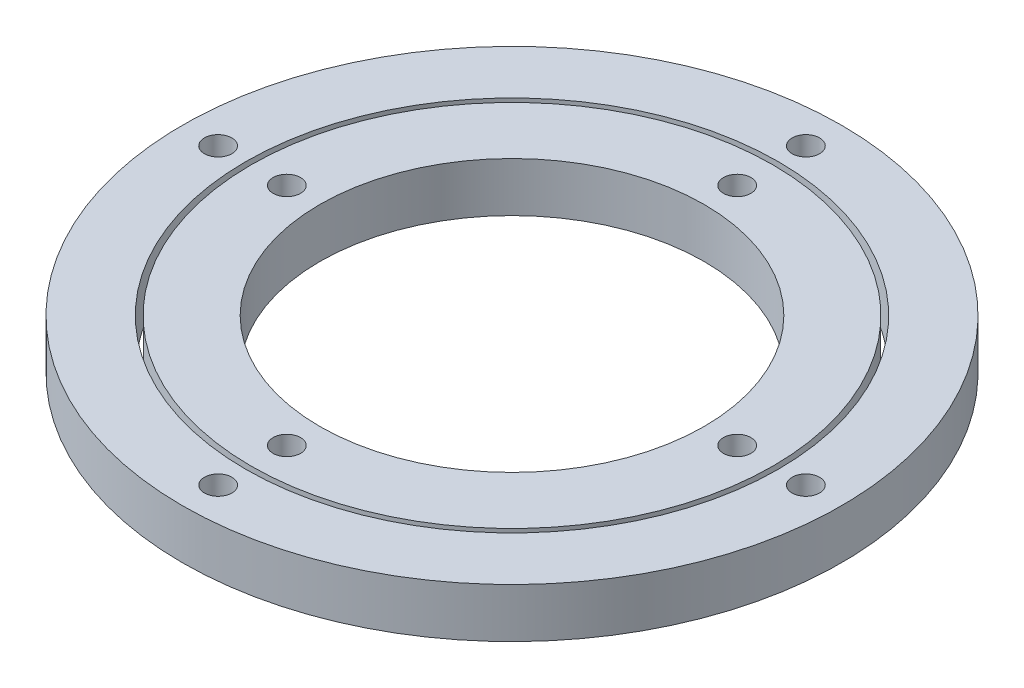
ISO-10303-21;
HEADER;
FILE_DESCRIPTION(('STEP AP214'),'2;1');
FILE_NAME('part.step','',(''),(''),'','','');
FILE_SCHEMA(('AUTOMOTIVE_DESIGN { 1 0 10303 214 1 1 1 1 }'));
ENDSEC;
DATA;
#1=APPLICATION_CONTEXT('core data for automotive mechanical design processes');
#2=APPLICATION_PROTOCOL_DEFINITION('international standard','automotive_design',2000,#1);
#3=PRODUCT_CONTEXT('',#1,'mechanical');
#4=PRODUCT('Part','Part','',(#3));
#5=PRODUCT_RELATED_PRODUCT_CATEGORY('part','',(#4));
#6=PRODUCT_DEFINITION_FORMATION('','',#4);
#7=PRODUCT_DEFINITION_CONTEXT('part definition',#1,'design');
#8=PRODUCT_DEFINITION('design','',#6,#7);
#9=PRODUCT_DEFINITION_SHAPE('','',#8);
#10=(LENGTH_UNIT() NAMED_UNIT(*) SI_UNIT(.MILLI.,.METRE.));
#11=(NAMED_UNIT(*) PLANE_ANGLE_UNIT() SI_UNIT($,.RADIAN.));
#12=(NAMED_UNIT(*) SI_UNIT($,.STERADIAN.) SOLID_ANGLE_UNIT());
#13=UNCERTAINTY_MEASURE_WITH_UNIT(LENGTH_MEASURE(1.E-05),#10,'distance_accuracy_value','');
#14=(GEOMETRIC_REPRESENTATION_CONTEXT(3) GLOBAL_UNCERTAINTY_ASSIGNED_CONTEXT((#13)) GLOBAL_UNIT_ASSIGNED_CONTEXT((#10,
#11,#12)) REPRESENTATION_CONTEXT('',''));
#15=CARTESIAN_POINT('',(0.,0.,0.));
#16=DIRECTION('',(0.,0.,1.));
#17=DIRECTION('',(1.,0.,0.));
#18=AXIS2_PLACEMENT_3D('',#15,#16,#17);
#19=CARTESIAN_POINT('',(0.,9.,0.));
#20=DIRECTION('',(0.,-1.,0.));
#21=DIRECTION('',(0.,0.,-1.));
#22=AXIS2_PLACEMENT_3D('',#19,#20,#21);
#23=CYLINDRICAL_SURFACE('',#22,60.);
#24=CARTESIAN_POINT('',(0.,9.,0.));
#25=DIRECTION('',(0.,-1.,0.));
#26=DIRECTION('',(0.,0.,-1.));
#27=AXIS2_PLACEMENT_3D('',#24,#25,#26);
#28=CIRCLE('',#27,60.);
#29=CARTESIAN_POINT('',(0.,9.,-60.));
#30=VERTEX_POINT('',#29);
#31=EDGE_CURVE('E11',#30,#30,#28,.T.);
#32=ORIENTED_EDGE('',*,*,#31,.T.);
#33=EDGE_LOOP('',(#32));
#34=FACE_BOUND('',#33,.T.);
#35=CARTESIAN_POINT('',(0.,0.,0.));
#36=DIRECTION('',(0.,-1.,0.));
#37=DIRECTION('',(0.,0.,-1.));
#38=AXIS2_PLACEMENT_3D('',#35,#36,#37);
#39=CIRCLE('',#38,60.);
#40=CARTESIAN_POINT('',(0.,0.,-60.));
#41=VERTEX_POINT('',#40);
#42=EDGE_CURVE('E45',#41,#41,#39,.T.);
#43=ORIENTED_EDGE('',*,*,#42,.F.);
#44=EDGE_LOOP('',(#43));
#45=FACE_BOUND('',#44,.T.);
#46=ADVANCED_FACE('F42',(#34,#45),#23,.T.);
#47=CARTESIAN_POINT('',(0.,9.,0.));
#48=DIRECTION('',(0.,-1.,0.));
#49=DIRECTION('',(0.,0.,-1.));
#50=AXIS2_PLACEMENT_3D('',#47,#48,#49);
#51=PLANE('',#50);
#52=CARTESIAN_POINT('',(53.5,9.,1.93514962252465E-13));
#53=DIRECTION('',(0.,-1.,0.));
#54=DIRECTION('',(0.,0.,-1.));
#55=AXIS2_PLACEMENT_3D('',#52,#53,#54);
#56=CIRCLE('',#55,2.5);
#57=CARTESIAN_POINT('',(53.5,9.,-2.49999999999981));
#58=VERTEX_POINT('',#57);
#59=EDGE_CURVE('E75',#58,#58,#56,.T.);
#60=ORIENTED_EDGE('',*,*,#59,.T.);
#61=EDGE_LOOP('',(#60));
#62=FACE_BOUND('',#61,.T.);
#63=CARTESIAN_POINT('',(0.,9.,-53.5));
#64=DIRECTION('',(0.,-1.,0.));
#65=DIRECTION('',(0.,0.,1.));
#66=AXIS2_PLACEMENT_3D('',#63,#64,#65);
#67=CIRCLE('',#66,2.5);
#68=CARTESIAN_POINT('',(0.,9.,-51.));
#69=VERTEX_POINT('',#68);
#70=EDGE_CURVE('E69',#69,#69,#67,.T.);
#71=ORIENTED_EDGE('',*,*,#70,.T.);
#72=EDGE_LOOP('',(#71));
#73=FACE_BOUND('',#72,.T.);
#74=CARTESIAN_POINT('',(-53.5,9.,1.80411241501588E-13));
#75=DIRECTION('',(0.,-1.,0.));
#76=DIRECTION('',(0.,0.,1.));
#77=AXIS2_PLACEMENT_3D('',#74,#75,#76);
#78=CIRCLE('',#77,2.5);
#79=CARTESIAN_POINT('',(-53.5,9.,2.50000000000018));
#80=VERTEX_POINT('',#79);
#81=EDGE_CURVE('E63',#80,#80,#78,.T.);
#82=ORIENTED_EDGE('',*,*,#81,.T.);
#83=EDGE_LOOP('',(#82));
#84=FACE_BOUND('',#83,.T.);
#85=CARTESIAN_POINT('',(0.,9.,53.5));
#86=DIRECTION('',(0.,-1.,0.));
#87=DIRECTION('',(0.,0.,-1.));
#88=AXIS2_PLACEMENT_3D('',#85,#86,#87);
#89=CIRCLE('',#88,2.5);
#90=CARTESIAN_POINT('',(0.,9.,51.));
#91=VERTEX_POINT('',#90);
#92=EDGE_CURVE('E57',#91,#91,#89,.T.);
#93=ORIENTED_EDGE('',*,*,#92,.T.);
#94=EDGE_LOOP('',(#93));
#95=FACE_BOUND('',#94,.T.);
#96=CARTESIAN_POINT('',(0.,9.,0.));
#97=DIRECTION('',(0.,-1.,0.));
#98=DIRECTION('',(0.,0.,-1.));
#99=AXIS2_PLACEMENT_3D('',#96,#97,#98);
#100=CIRCLE('',#99,48.5);
#101=CARTESIAN_POINT('',(0.,9.,-48.5));
#102=VERTEX_POINT('',#101);
#103=EDGE_CURVE('E52',#102,#102,#100,.T.);
#104=ORIENTED_EDGE('',*,*,#103,.T.);
#105=EDGE_LOOP('',(#104));
#106=FACE_BOUND('',#105,.T.);
#107=ORIENTED_EDGE('',*,*,#31,.F.);
#108=EDGE_LOOP('',(#107));
#109=FACE_BOUND('',#108,.T.);
#110=ADVANCED_FACE('F84',(#62,#73,#84,#95,#106,#109),#51,.F.);
#111=CARTESIAN_POINT('',(0.,0.,0.));
#112=DIRECTION('',(0.,-1.,0.));
#113=DIRECTION('',(0.,0.,-1.));
#114=AXIS2_PLACEMENT_3D('',#111,#112,#113);
#115=PLANE('',#114);
#116=CARTESIAN_POINT('',(53.5,0.,1.93514962252465E-13));
#117=DIRECTION('',(0.,-1.,0.));
#118=DIRECTION('',(0.,0.,-1.));
#119=AXIS2_PLACEMENT_3D('',#116,#117,#118);
#120=CIRCLE('',#119,2.5);
#121=CARTESIAN_POINT('',(53.5,0.,-2.49999999999981));
#122=VERTEX_POINT('',#121);
#123=EDGE_CURVE('E78',#122,#122,#120,.T.);
#124=ORIENTED_EDGE('',*,*,#123,.F.);
#125=EDGE_LOOP('',(#124));
#126=FACE_BOUND('',#125,.T.);
#127=CARTESIAN_POINT('',(0.,0.,-53.5));
#128=DIRECTION('',(0.,-1.,0.));
#129=DIRECTION('',(0.,0.,1.));
#130=AXIS2_PLACEMENT_3D('',#127,#128,#129);
#131=CIRCLE('',#130,2.5);
#132=CARTESIAN_POINT('',(0.,0.,-51.));
#133=VERTEX_POINT('',#132);
#134=EDGE_CURVE('E72',#133,#133,#131,.T.);
#135=ORIENTED_EDGE('',*,*,#134,.F.);
#136=EDGE_LOOP('',(#135));
#137=FACE_BOUND('',#136,.T.);
#138=CARTESIAN_POINT('',(-53.5,0.,1.80411241501588E-13));
#139=DIRECTION('',(0.,-1.,0.));
#140=DIRECTION('',(0.,0.,1.));
#141=AXIS2_PLACEMENT_3D('',#138,#139,#140);
#142=CIRCLE('',#141,2.5);
#143=CARTESIAN_POINT('',(-53.5,0.,2.50000000000018));
#144=VERTEX_POINT('',#143);
#145=EDGE_CURVE('E66',#144,#144,#142,.T.);
#146=ORIENTED_EDGE('',*,*,#145,.F.);
#147=EDGE_LOOP('',(#146));
#148=FACE_BOUND('',#147,.T.);
#149=CARTESIAN_POINT('',(0.,0.,53.5));
#150=DIRECTION('',(0.,-1.,0.));
#151=DIRECTION('',(0.,0.,-1.));
#152=AXIS2_PLACEMENT_3D('',#149,#150,#151);
#153=CIRCLE('',#152,2.5);
#154=CARTESIAN_POINT('',(0.,0.,51.));
#155=VERTEX_POINT('',#154);
#156=EDGE_CURVE('E60',#155,#155,#153,.T.);
#157=ORIENTED_EDGE('',*,*,#156,.F.);
#158=EDGE_LOOP('',(#157));
#159=FACE_BOUND('',#158,.T.);
#160=CARTESIAN_POINT('',(0.,0.,0.));
#161=DIRECTION('',(0.,-1.,0.));
#162=DIRECTION('',(0.,0.,-1.));
#163=AXIS2_PLACEMENT_3D('',#160,#161,#162);
#164=CIRCLE('',#163,48.5);
#165=CARTESIAN_POINT('',(0.,0.,-48.5));
#166=VERTEX_POINT('',#165);
#167=EDGE_CURVE('E54',#166,#166,#164,.T.);
#168=ORIENTED_EDGE('',*,*,#167,.F.);
#169=EDGE_LOOP('',(#168));
#170=FACE_BOUND('',#169,.T.);
#171=ORIENTED_EDGE('',*,*,#42,.T.);
#172=EDGE_LOOP('',(#171));
#173=FACE_BOUND('',#172,.T.);
#174=ADVANCED_FACE('F94',(#126,#137,#148,#159,#170,#173),#115,.T.);
#175=CARTESIAN_POINT('',(0.,9.,0.));
#176=DIRECTION('',(0.,-1.,0.));
#177=DIRECTION('',(0.,0.,-1.));
#178=AXIS2_PLACEMENT_3D('',#175,#176,#177);
#179=CYLINDRICAL_SURFACE('',#178,48.5);
#180=ORIENTED_EDGE('',*,*,#103,.F.);
#181=EDGE_LOOP('',(#180));
#182=FACE_BOUND('',#181,.T.);
#183=ORIENTED_EDGE('',*,*,#167,.T.);
#184=EDGE_LOOP('',(#183));
#185=FACE_BOUND('',#184,.T.);
#186=ADVANCED_FACE('F97',(#182,#185),#179,.F.);
#187=CARTESIAN_POINT('',(0.,9.,53.5));
#188=DIRECTION('',(0.,-1.,0.));
#189=DIRECTION('',(0.,0.,-1.));
#190=AXIS2_PLACEMENT_3D('',#187,#188,#189);
#191=CYLINDRICAL_SURFACE('',#190,2.5);
#192=ORIENTED_EDGE('',*,*,#92,.F.);
#193=EDGE_LOOP('',(#192));
#194=FACE_BOUND('',#193,.T.);
#195=ORIENTED_EDGE('',*,*,#156,.T.);
#196=EDGE_LOOP('',(#195));
#197=FACE_BOUND('',#196,.T.);
#198=ADVANCED_FACE('F118',(#194,#197),#191,.F.);
#199=CARTESIAN_POINT('',(-53.5,9.,1.80411241501588E-13));
#200=DIRECTION('',(0.,-1.,0.));
#201=DIRECTION('',(0.,0.,-1.));
#202=AXIS2_PLACEMENT_3D('',#199,#200,#201);
#203=CYLINDRICAL_SURFACE('',#202,2.5);
#204=ORIENTED_EDGE('',*,*,#81,.F.);
#205=EDGE_LOOP('',(#204));
#206=FACE_BOUND('',#205,.T.);
#207=ORIENTED_EDGE('',*,*,#145,.T.);
#208=EDGE_LOOP('',(#207));
#209=FACE_BOUND('',#208,.T.);
#210=ADVANCED_FACE('F122',(#206,#209),#203,.F.);
#211=CARTESIAN_POINT('',(0.,9.,-53.5));
#212=DIRECTION('',(0.,-1.,0.));
#213=DIRECTION('',(0.,0.,-1.));
#214=AXIS2_PLACEMENT_3D('',#211,#212,#213);
#215=CYLINDRICAL_SURFACE('',#214,2.5);
#216=ORIENTED_EDGE('',*,*,#70,.F.);
#217=EDGE_LOOP('',(#216));
#218=FACE_BOUND('',#217,.T.);
#219=ORIENTED_EDGE('',*,*,#134,.T.);
#220=EDGE_LOOP('',(#219));
#221=FACE_BOUND('',#220,.T.);
#222=ADVANCED_FACE('F90',(#218,#221),#215,.F.);
#223=CARTESIAN_POINT('',(53.5,9.,1.93514962252465E-13));
#224=DIRECTION('',(0.,-1.,0.));
#225=DIRECTION('',(0.,0.,-1.));
#226=AXIS2_PLACEMENT_3D('',#223,#224,#225);
#227=CYLINDRICAL_SURFACE('',#226,2.5);
#228=ORIENTED_EDGE('',*,*,#59,.F.);
#229=EDGE_LOOP('',(#228));
#230=FACE_BOUND('',#229,.T.);
#231=ORIENTED_EDGE('',*,*,#123,.T.);
#232=EDGE_LOOP('',(#231));
#233=FACE_BOUND('',#232,.T.);
#234=ADVANCED_FACE('F87',(#230,#233),#227,.F.);
#235=CLOSED_SHELL('',(#46,#110,#174,#186,#198,#210,#222,#234));
#236=MANIFOLD_SOLID_BREP('B2',#235);
#237=CARTESIAN_POINT('',(0.,9.,0.));
#238=DIRECTION('',(0.,1.,0.));
#239=DIRECTION('',(0.,0.,1.));
#240=AXIS2_PLACEMENT_3D('',#237,#238,#239);
#241=PLANE('',#240);
#242=CARTESIAN_POINT('',(1.04083408558608E-12,9.,41.));
#243=DIRECTION('',(0.,1.,0.));
#244=DIRECTION('',(0.,0.,1.));
#245=AXIS2_PLACEMENT_3D('',#242,#243,#244);
#246=CIRCLE('',#245,2.5);
#247=CARTESIAN_POINT('',(1.04083408558608E-12,9.,43.5));
#248=VERTEX_POINT('',#247);
#249=EDGE_CURVE('E215',#248,#248,#246,.T.);
#250=ORIENTED_EDGE('',*,*,#249,.F.);
#251=EDGE_LOOP('',(#250));
#252=FACE_BOUND('',#251,.T.);
#253=CARTESIAN_POINT('',(-41.,9.,0.));
#254=DIRECTION('',(0.,1.,0.));
#255=DIRECTION('',(0.,0.,1.));
#256=AXIS2_PLACEMENT_3D('',#253,#254,#255);
#257=CIRCLE('',#256,2.5);
#258=CARTESIAN_POINT('',(-41.,9.,2.5));
#259=VERTEX_POINT('',#258);
#260=EDGE_CURVE('E203',#259,#259,#257,.T.);
#261=ORIENTED_EDGE('',*,*,#260,.F.);
#262=EDGE_LOOP('',(#261));
#263=FACE_BOUND('',#262,.T.);
#264=CARTESIAN_POINT('',(0.,9.,0.));
#265=DIRECTION('',(0.,1.,0.));
#266=DIRECTION('',(0.,0.,1.));
#267=AXIS2_PLACEMENT_3D('',#264,#265,#266);
#268=CIRCLE('',#267,47.5);
#269=CARTESIAN_POINT('',(0.,9.,47.5));
#270=VERTEX_POINT('',#269);
#271=EDGE_CURVE('E41',#270,#270,#268,.T.);
#272=ORIENTED_EDGE('',*,*,#271,.T.);
#273=EDGE_LOOP('',(#272));
#274=FACE_BOUND('',#273,.T.);
#275=CARTESIAN_POINT('',(0.,9.,0.));
#276=DIRECTION('',(0.,1.,0.));
#277=DIRECTION('',(0.,0.,1.));
#278=AXIS2_PLACEMENT_3D('',#275,#276,#277);
#279=CIRCLE('',#278,35.);
#280=CARTESIAN_POINT('',(0.,9.,35.));
#281=VERTEX_POINT('',#280);
#282=EDGE_CURVE('E198',#281,#281,#279,.T.);
#283=ORIENTED_EDGE('',*,*,#282,.F.);
#284=EDGE_LOOP('',(#283));
#285=FACE_BOUND('',#284,.T.);
#286=CARTESIAN_POINT('',(41.,9.,0.));
#287=DIRECTION('',(0.,1.,0.));
#288=DIRECTION('',(0.,0.,-1.));
#289=AXIS2_PLACEMENT_3D('',#286,#287,#288);
#290=CIRCLE('',#289,2.5);
#291=CARTESIAN_POINT('',(41.,9.,-2.50000000000001));
#292=VERTEX_POINT('',#291);
#293=EDGE_CURVE('E209',#292,#292,#290,.T.);
#294=ORIENTED_EDGE('',*,*,#293,.F.);
#295=EDGE_LOOP('',(#294));
#296=FACE_BOUND('',#295,.T.);
#297=CARTESIAN_POINT('',(-1.04777297948999E-12,9.,-41.));
#298=DIRECTION('',(0.,1.,0.));
#299=DIRECTION('',(0.,0.,-1.));
#300=AXIS2_PLACEMENT_3D('',#297,#298,#299);
#301=CIRCLE('',#300,2.5);
#302=CARTESIAN_POINT('',(-1.04777297948999E-12,9.,-43.5));
#303=VERTEX_POINT('',#302);
#304=EDGE_CURVE('E221',#303,#303,#301,.T.);
#305=ORIENTED_EDGE('',*,*,#304,.F.);
#306=EDGE_LOOP('',(#305));
#307=FACE_BOUND('',#306,.T.);
#308=ADVANCED_FACE('F187',(#252,#263,#274,#285,#296,#307),#241,.T.);
#309=CARTESIAN_POINT('',(0.,0.,0.));
#310=DIRECTION('',(0.,1.,0.));
#311=DIRECTION('',(0.,0.,1.));
#312=AXIS2_PLACEMENT_3D('',#309,#310,#311);
#313=PLANE('',#312);
#314=CARTESIAN_POINT('',(0.,0.,0.));
#315=DIRECTION('',(0.,1.,0.));
#316=DIRECTION('',(0.,0.,1.));
#317=AXIS2_PLACEMENT_3D('',#314,#315,#316);
#318=CIRCLE('',#317,47.5);
#319=CARTESIAN_POINT('',(0.,0.,47.5));
#320=VERTEX_POINT('',#319);
#321=EDGE_CURVE('E191',#320,#320,#318,.T.);
#322=ORIENTED_EDGE('',*,*,#321,.F.);
#323=EDGE_LOOP('',(#322));
#324=FACE_BOUND('',#323,.T.);
#325=CARTESIAN_POINT('',(0.,0.,0.));
#326=DIRECTION('',(0.,1.,0.));
#327=DIRECTION('',(0.,0.,1.));
#328=AXIS2_PLACEMENT_3D('',#325,#326,#327);
#329=CIRCLE('',#328,35.);
#330=CARTESIAN_POINT('',(0.,0.,35.));
#331=VERTEX_POINT('',#330);
#332=EDGE_CURVE('E200',#331,#331,#329,.T.);
#333=ORIENTED_EDGE('',*,*,#332,.T.);
#334=EDGE_LOOP('',(#333));
#335=FACE_BOUND('',#334,.T.);
#336=CARTESIAN_POINT('',(-41.,0.,0.));
#337=DIRECTION('',(0.,1.,0.));
#338=DIRECTION('',(0.,0.,1.));
#339=AXIS2_PLACEMENT_3D('',#336,#337,#338);
#340=CIRCLE('',#339,2.5);
#341=CARTESIAN_POINT('',(-41.,0.,2.5));
#342=VERTEX_POINT('',#341);
#343=EDGE_CURVE('E206',#342,#342,#340,.T.);
#344=ORIENTED_EDGE('',*,*,#343,.T.);
#345=EDGE_LOOP('',(#344));
#346=FACE_BOUND('',#345,.T.);
#347=CARTESIAN_POINT('',(41.,0.,0.));
#348=DIRECTION('',(0.,1.,0.));
#349=DIRECTION('',(0.,0.,-1.));
#350=AXIS2_PLACEMENT_3D('',#347,#348,#349);
#351=CIRCLE('',#350,2.5);
#352=CARTESIAN_POINT('',(41.,0.,-2.50000000000001));
#353=VERTEX_POINT('',#352);
#354=EDGE_CURVE('E212',#353,#353,#351,.T.);
#355=ORIENTED_EDGE('',*,*,#354,.T.);
#356=EDGE_LOOP('',(#355));
#357=FACE_BOUND('',#356,.T.);
#358=CARTESIAN_POINT('',(1.04083408558608E-12,0.,41.));
#359=DIRECTION('',(0.,1.,0.));
#360=DIRECTION('',(0.,0.,1.));
#361=AXIS2_PLACEMENT_3D('',#358,#359,#360);
#362=CIRCLE('',#361,2.5);
#363=CARTESIAN_POINT('',(1.04083408558608E-12,0.,43.5));
#364=VERTEX_POINT('',#363);
#365=EDGE_CURVE('E218',#364,#364,#362,.T.);
#366=ORIENTED_EDGE('',*,*,#365,.T.);
#367=EDGE_LOOP('',(#366));
#368=FACE_BOUND('',#367,.T.);
#369=CARTESIAN_POINT('',(-1.04777297948999E-12,0.,-41.));
#370=DIRECTION('',(0.,1.,0.));
#371=DIRECTION('',(0.,0.,-1.));
#372=AXIS2_PLACEMENT_3D('',#369,#370,#371);
#373=CIRCLE('',#372,2.5);
#374=CARTESIAN_POINT('',(-1.04777297948999E-12,0.,-43.5));
#375=VERTEX_POINT('',#374);
#376=EDGE_CURVE('E224',#375,#375,#373,.T.);
#377=ORIENTED_EDGE('',*,*,#376,.T.);
#378=EDGE_LOOP('',(#377));
#379=FACE_BOUND('',#378,.T.);
#380=ADVANCED_FACE('F234',(#324,#335,#346,#357,#368,#379),#313,.F.);
#381=CARTESIAN_POINT('',(0.,9.,0.));
#382=DIRECTION('',(0.,-1.,0.));
#383=DIRECTION('',(0.,0.,-1.));
#384=AXIS2_PLACEMENT_3D('',#381,#382,#383);
#385=CYLINDRICAL_SURFACE('',#384,47.5);
#386=ORIENTED_EDGE('',*,*,#271,.F.);
#387=EDGE_LOOP('',(#386));
#388=FACE_BOUND('',#387,.T.);
#389=ORIENTED_EDGE('',*,*,#321,.T.);
#390=EDGE_LOOP('',(#389));
#391=FACE_BOUND('',#390,.T.);
#392=ADVANCED_FACE('F189',(#388,#391),#385,.T.);
#393=CARTESIAN_POINT('',(0.,9.,0.));
#394=DIRECTION('',(0.,-1.,0.));
#395=DIRECTION('',(0.,0.,-1.));
#396=AXIS2_PLACEMENT_3D('',#393,#394,#395);
#397=CYLINDRICAL_SURFACE('',#396,35.);
#398=ORIENTED_EDGE('',*,*,#282,.T.);
#399=EDGE_LOOP('',(#398));
#400=FACE_BOUND('',#399,.T.);
#401=ORIENTED_EDGE('',*,*,#332,.F.);
#402=EDGE_LOOP('',(#401));
#403=FACE_BOUND('',#402,.T.);
#404=ADVANCED_FACE('F244',(#400,#403),#397,.F.);
#405=CARTESIAN_POINT('',(-41.,9.,0.));
#406=DIRECTION('',(0.,-1.,0.));
#407=DIRECTION('',(0.,0.,-1.));
#408=AXIS2_PLACEMENT_3D('',#405,#406,#407);
#409=CYLINDRICAL_SURFACE('',#408,2.5);
#410=ORIENTED_EDGE('',*,*,#260,.T.);
#411=EDGE_LOOP('',(#410));
#412=FACE_BOUND('',#411,.T.);
#413=ORIENTED_EDGE('',*,*,#343,.F.);
#414=EDGE_LOOP('',(#413));
#415=FACE_BOUND('',#414,.T.);
#416=ADVANCED_FACE('F247',(#412,#415),#409,.F.);
#417=CARTESIAN_POINT('',(41.,9.,0.));
#418=DIRECTION('',(0.,-1.,0.));
#419=DIRECTION('',(0.,0.,-1.));
#420=AXIS2_PLACEMENT_3D('',#417,#418,#419);
#421=CYLINDRICAL_SURFACE('',#420,2.5);
#422=ORIENTED_EDGE('',*,*,#293,.T.);
#423=EDGE_LOOP('',(#422));
#424=FACE_BOUND('',#423,.T.);
#425=ORIENTED_EDGE('',*,*,#354,.F.);
#426=EDGE_LOOP('',(#425));
#427=FACE_BOUND('',#426,.T.);
#428=ADVANCED_FACE('F251',(#424,#427),#421,.F.);
#429=CARTESIAN_POINT('',(1.04083408558608E-12,9.,41.));
#430=DIRECTION('',(0.,-1.,0.));
#431=DIRECTION('',(0.,0.,-1.));
#432=AXIS2_PLACEMENT_3D('',#429,#430,#431);
#433=CYLINDRICAL_SURFACE('',#432,2.5);
#434=ORIENTED_EDGE('',*,*,#249,.T.);
#435=EDGE_LOOP('',(#434));
#436=FACE_BOUND('',#435,.T.);
#437=ORIENTED_EDGE('',*,*,#365,.F.);
#438=EDGE_LOOP('',(#437));
#439=FACE_BOUND('',#438,.T.);
#440=ADVANCED_FACE('F255',(#436,#439),#433,.F.);
#441=CARTESIAN_POINT('',(-1.04777297948999E-12,9.,-41.));
#442=DIRECTION('',(0.,-1.,0.));
#443=DIRECTION('',(0.,0.,-1.));
#444=AXIS2_PLACEMENT_3D('',#441,#442,#443);
#445=CYLINDRICAL_SURFACE('',#444,2.5);
#446=ORIENTED_EDGE('',*,*,#304,.T.);
#447=EDGE_LOOP('',(#446));
#448=FACE_BOUND('',#447,.T.);
#449=ORIENTED_EDGE('',*,*,#376,.F.);
#450=EDGE_LOOP('',(#449));
#451=FACE_BOUND('',#450,.T.);
#452=ADVANCED_FACE('F230',(#448,#451),#445,.F.);
#453=CLOSED_SHELL('',(#308,#380,#392,#404,#416,#428,#440,#452));
#454=MANIFOLD_SOLID_BREP('B6',#453);
#455=ADVANCED_BREP_SHAPE_REPRESENTATION('',(#18,#236,#454),#14);
#456=SHAPE_DEFINITION_REPRESENTATION(#9,#455);
ENDSEC;
END-ISO-10303-21;
